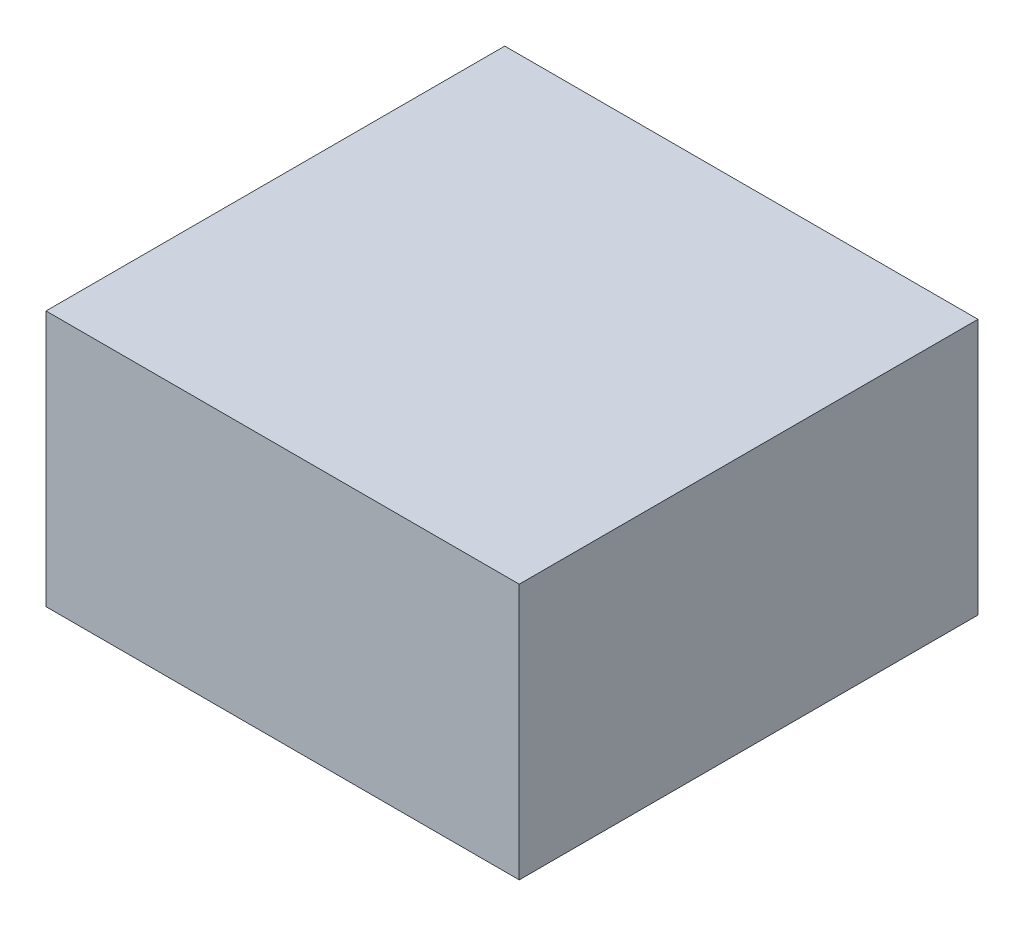
ISO-10303-21;
HEADER;
FILE_DESCRIPTION(('STEP AP214'),'2;1');
FILE_NAME('part.step','',(''),(''),'','','');
FILE_SCHEMA(('AUTOMOTIVE_DESIGN { 1 0 10303 214 1 1 1 1 }'));
ENDSEC;
DATA;
#1=APPLICATION_CONTEXT('core data for automotive mechanical design processes');
#2=APPLICATION_PROTOCOL_DEFINITION('international standard','automotive_design',2000,#1);
#3=PRODUCT_CONTEXT('',#1,'mechanical');
#4=PRODUCT('Part','Part','',(#3));
#5=PRODUCT_RELATED_PRODUCT_CATEGORY('part','',(#4));
#6=PRODUCT_DEFINITION_FORMATION('','',#4);
#7=PRODUCT_DEFINITION_CONTEXT('part definition',#1,'design');
#8=PRODUCT_DEFINITION('design','',#6,#7);
#9=PRODUCT_DEFINITION_SHAPE('','',#8);
#10=(LENGTH_UNIT() NAMED_UNIT(*) SI_UNIT(.MILLI.,.METRE.));
#11=(NAMED_UNIT(*) PLANE_ANGLE_UNIT() SI_UNIT($,.RADIAN.));
#12=(NAMED_UNIT(*) SI_UNIT($,.STERADIAN.) SOLID_ANGLE_UNIT());
#13=UNCERTAINTY_MEASURE_WITH_UNIT(LENGTH_MEASURE(1.E-05),#10,'distance_accuracy_value','');
#14=(GEOMETRIC_REPRESENTATION_CONTEXT(3) GLOBAL_UNCERTAINTY_ASSIGNED_CONTEXT((#13)) GLOBAL_UNIT_ASSIGNED_CONTEXT((#10,
#11,#12)) REPRESENTATION_CONTEXT('',''));
#15=CARTESIAN_POINT('',(0.,0.,0.));
#16=DIRECTION('',(0.,0.,1.));
#17=DIRECTION('',(1.,0.,0.));
#18=AXIS2_PLACEMENT_3D('',#15,#16,#17);
#19=CARTESIAN_POINT('',(0.,10.,0.));
#20=DIRECTION('',(1.,0.,0.));
#21=DIRECTION('',(0.,0.,-1.));
#22=AXIS2_PLACEMENT_3D('',#19,#20,#21);
#23=PLANE('',#22);
#24=DIRECTION('',(0.,0.,1.));
#25=VECTOR('',#24,1.);
#26=CARTESIAN_POINT('',(0.,0.,0.));
#27=LINE('',#26,#25);
#28=CARTESIAN_POINT('',(0.,0.,-17.9113793103448));
#29=VERTEX_POINT('',#28);
#30=CARTESIAN_POINT('',(0.,0.,0.));
#31=VERTEX_POINT('',#30);
#32=EDGE_CURVE('E96',#29,#31,#27,.T.);
#33=ORIENTED_EDGE('',*,*,#32,.T.);
#34=DIRECTION('',(0.,-1.,0.));
#35=VECTOR('',#34,1.);
#36=CARTESIAN_POINT('',(0.,10.,0.));
#37=LINE('',#36,#35);
#38=CARTESIAN_POINT('',(0.,10.,0.));
#39=VERTEX_POINT('',#38);
#40=EDGE_CURVE('E11',#39,#31,#37,.T.);
#41=ORIENTED_EDGE('',*,*,#40,.F.);
#42=DIRECTION('',(0.,0.,1.));
#43=VECTOR('',#42,1.);
#44=CARTESIAN_POINT('',(0.,10.,0.));
#45=LINE('',#44,#43);
#46=CARTESIAN_POINT('',(0.,10.,-17.9113793103448));
#47=VERTEX_POINT('',#46);
#48=EDGE_CURVE('E84',#47,#39,#45,.T.);
#49=ORIENTED_EDGE('',*,*,#48,.F.);
#50=DIRECTION('',(0.,-1.,0.));
#51=VECTOR('',#50,1.);
#52=CARTESIAN_POINT('',(0.,10.,-17.9113793103448));
#53=LINE('',#52,#51);
#54=EDGE_CURVE('E92',#47,#29,#53,.T.);
#55=ORIENTED_EDGE('',*,*,#54,.T.);
#56=EDGE_LOOP('',(#33,#41,#49,#55));
#57=FACE_BOUND('',#56,.T.);
#58=ADVANCED_FACE('F33',(#57),#23,.F.);
#59=CARTESIAN_POINT('',(0.,10.,0.));
#60=DIRECTION('',(0.,0.,-1.));
#61=DIRECTION('',(-1.,0.,0.));
#62=AXIS2_PLACEMENT_3D('',#59,#60,#61);
#63=PLANE('',#62);
#64=DIRECTION('',(1.,0.,0.));
#65=VECTOR('',#64,1.);
#66=CARTESIAN_POINT('',(0.,0.,0.));
#67=LINE('',#66,#65);
#68=CARTESIAN_POINT('',(18.4769677631399,0.,0.));
#69=VERTEX_POINT('',#68);
#70=EDGE_CURVE('E88',#31,#69,#67,.T.);
#71=ORIENTED_EDGE('',*,*,#70,.T.);
#72=DIRECTION('',(0.,-1.,0.));
#73=VECTOR('',#72,1.);
#74=CARTESIAN_POINT('',(18.4769677631399,10.,0.));
#75=LINE('',#74,#73);
#76=CARTESIAN_POINT('',(18.4769677631399,10.,0.));
#77=VERTEX_POINT('',#76);
#78=EDGE_CURVE('E41',#77,#69,#75,.T.);
#79=ORIENTED_EDGE('',*,*,#78,.F.);
#80=DIRECTION('',(1.,0.,0.));
#81=VECTOR('',#80,1.);
#82=CARTESIAN_POINT('',(0.,10.,0.));
#83=LINE('',#82,#81);
#84=EDGE_CURVE('E79',#39,#77,#83,.T.);
#85=ORIENTED_EDGE('',*,*,#84,.F.);
#86=ORIENTED_EDGE('',*,*,#40,.T.);
#87=EDGE_LOOP('',(#71,#79,#85,#86));
#88=FACE_BOUND('',#87,.T.);
#89=ADVANCED_FACE('F87',(#88),#63,.F.);
#90=CARTESIAN_POINT('',(18.4769677631399,10.,0.));
#91=DIRECTION('',(-1.,0.,0.));
#92=DIRECTION('',(0.,0.,1.));
#93=AXIS2_PLACEMENT_3D('',#90,#91,#92);
#94=PLANE('',#93);
#95=DIRECTION('',(0.,0.,-1.));
#96=VECTOR('',#95,1.);
#97=CARTESIAN_POINT('',(18.4769677631399,0.,0.));
#98=LINE('',#97,#96);
#99=CARTESIAN_POINT('',(18.4769677631399,0.,-17.9113793103448));
#100=VERTEX_POINT('',#99);
#101=EDGE_CURVE('E66',#69,#100,#98,.T.);
#102=ORIENTED_EDGE('',*,*,#101,.T.);
#103=DIRECTION('',(0.,-1.,0.));
#104=VECTOR('',#103,1.);
#105=CARTESIAN_POINT('',(18.4769677631399,10.,-17.9113793103448));
#106=LINE('',#105,#104);
#107=CARTESIAN_POINT('',(18.4769677631399,10.,-17.9113793103448));
#108=VERTEX_POINT('',#107);
#109=EDGE_CURVE('E89',#108,#100,#106,.T.);
#110=ORIENTED_EDGE('',*,*,#109,.F.);
#111=DIRECTION('',(0.,0.,-1.));
#112=VECTOR('',#111,1.);
#113=CARTESIAN_POINT('',(18.4769677631399,10.,0.));
#114=LINE('',#113,#112);
#115=EDGE_CURVE('E82',#77,#108,#114,.T.);
#116=ORIENTED_EDGE('',*,*,#115,.F.);
#117=ORIENTED_EDGE('',*,*,#78,.T.);
#118=EDGE_LOOP('',(#102,#110,#116,#117));
#119=FACE_BOUND('',#118,.T.);
#120=ADVANCED_FACE('F90',(#119),#94,.F.);
#121=CARTESIAN_POINT('',(0.,10.,-17.9113793103448));
#122=DIRECTION('',(0.,0.,1.));
#123=DIRECTION('',(1.,0.,0.));
#124=AXIS2_PLACEMENT_3D('',#121,#122,#123);
#125=PLANE('',#124);
#126=DIRECTION('',(-1.,0.,0.));
#127=VECTOR('',#126,1.);
#128=CARTESIAN_POINT('',(0.,0.,-17.9113793103448));
#129=LINE('',#128,#127);
#130=EDGE_CURVE('E72',#100,#29,#129,.T.);
#131=ORIENTED_EDGE('',*,*,#130,.T.);
#132=ORIENTED_EDGE('',*,*,#54,.F.);
#133=DIRECTION('',(-1.,0.,0.));
#134=VECTOR('',#133,1.);
#135=CARTESIAN_POINT('',(0.,10.,-17.9113793103448));
#136=LINE('',#135,#134);
#137=EDGE_CURVE('E49',#108,#47,#136,.T.);
#138=ORIENTED_EDGE('',*,*,#137,.F.);
#139=ORIENTED_EDGE('',*,*,#109,.T.);
#140=EDGE_LOOP('',(#131,#132,#138,#139));
#141=FACE_BOUND('',#140,.T.);
#142=ADVANCED_FACE('F103',(#141),#125,.F.);
#143=CARTESIAN_POINT('',(0.,10.,0.));
#144=DIRECTION('',(0.,-1.,0.));
#145=DIRECTION('',(0.,0.,-1.));
#146=AXIS2_PLACEMENT_3D('',#143,#144,#145);
#147=PLANE('',#146);
#148=ORIENTED_EDGE('',*,*,#48,.T.);
#149=ORIENTED_EDGE('',*,*,#84,.T.);
#150=ORIENTED_EDGE('',*,*,#115,.T.);
#151=ORIENTED_EDGE('',*,*,#137,.T.);
#152=EDGE_LOOP('',(#148,#149,#150,#151));
#153=FACE_BOUND('',#152,.T.);
#154=ADVANCED_FACE('F80',(#153),#147,.F.);
#155=CARTESIAN_POINT('',(0.,0.,0.));
#156=DIRECTION('',(0.,-1.,0.));
#157=DIRECTION('',(0.,0.,-1.));
#158=AXIS2_PLACEMENT_3D('',#155,#156,#157);
#159=PLANE('',#158);
#160=ORIENTED_EDGE('',*,*,#32,.F.);
#161=ORIENTED_EDGE('',*,*,#130,.F.);
#162=ORIENTED_EDGE('',*,*,#101,.F.);
#163=ORIENTED_EDGE('',*,*,#70,.F.);
#164=EDGE_LOOP('',(#160,#161,#162,#163));
#165=FACE_BOUND('',#164,.T.);
#166=ADVANCED_FACE('F106',(#165),#159,.T.);
#167=CLOSED_SHELL('',(#58,#89,#120,#142,#154,#166));
#168=MANIFOLD_SOLID_BREP('B2',#167);
#169=ADVANCED_BREP_SHAPE_REPRESENTATION('',(#18,#168),#14);
#170=SHAPE_DEFINITION_REPRESENTATION(#9,#169);
ENDSEC;
END-ISO-10303-21;
